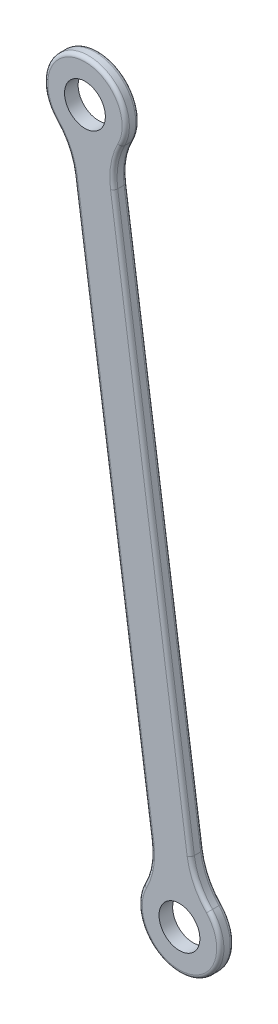
ISO-10303-21;
HEADER;
FILE_DESCRIPTION(('STEP AP214'),'2;1');
FILE_NAME('part.step','',(''),(''),'','','');
FILE_SCHEMA(('AUTOMOTIVE_DESIGN { 1 0 10303 214 1 1 1 1 }'));
ENDSEC;
DATA;
#1=APPLICATION_CONTEXT('core data for automotive mechanical design processes');
#2=APPLICATION_PROTOCOL_DEFINITION('international standard','automotive_design',2000,#1);
#3=PRODUCT_CONTEXT('',#1,'mechanical');
#4=PRODUCT('Part','Part','',(#3));
#5=PRODUCT_RELATED_PRODUCT_CATEGORY('part','',(#4));
#6=PRODUCT_DEFINITION_FORMATION('','',#4);
#7=PRODUCT_DEFINITION_CONTEXT('part definition',#1,'design');
#8=PRODUCT_DEFINITION('design','',#6,#7);
#9=PRODUCT_DEFINITION_SHAPE('','',#8);
#10=(LENGTH_UNIT() NAMED_UNIT(*) SI_UNIT(.MILLI.,.METRE.));
#11=(NAMED_UNIT(*) PLANE_ANGLE_UNIT() SI_UNIT($,.RADIAN.));
#12=(NAMED_UNIT(*) SI_UNIT($,.STERADIAN.) SOLID_ANGLE_UNIT());
#13=UNCERTAINTY_MEASURE_WITH_UNIT(LENGTH_MEASURE(1.E-05),#10,'distance_accuracy_value','');
#14=(GEOMETRIC_REPRESENTATION_CONTEXT(3) GLOBAL_UNCERTAINTY_ASSIGNED_CONTEXT((#13)) GLOBAL_UNIT_ASSIGNED_CONTEXT((#10,
#11,#12)) REPRESENTATION_CONTEXT('',''));
#15=CARTESIAN_POINT('',(0.,0.,0.));
#16=DIRECTION('',(0.,0.,1.));
#17=DIRECTION('',(1.,0.,0.));
#18=AXIS2_PLACEMENT_3D('',#15,#16,#17);
#19=CARTESIAN_POINT('',(23.1281496655135,3.28811705612887,1.5));
#20=DIRECTION('',(0.9900445829199,0.140754125449172,0.));
#21=DIRECTION('',(-0.140754125449172,0.9900445829199,0.));
#22=AXIS2_PLACEMENT_3D('',#19,#20,#21);
#23=PLANE('',#22);
#24=DIRECTION('',(0.,0.,1.));
#25=VECTOR('',#24,1.);
#26=CARTESIAN_POINT('',(10.1295553988988,94.7183880920054,1.5));
#27=LINE('',#26,#25);
#28=CARTESIAN_POINT('',(10.1295553988988,94.7183880920054,-0.7));
#29=VERTEX_POINT('',#28);
#30=CARTESIAN_POINT('',(10.1295553988988,94.7183880920054,0.7));
#31=VERTEX_POINT('',#30);
#32=EDGE_CURVE('E170',#29,#31,#27,.T.);
#33=ORIENTED_EDGE('',*,*,#32,.T.);
#34=DIRECTION('',(0.140754125449172,-0.9900445829199,0.));
#35=VECTOR('',#34,1.);
#36=CARTESIAN_POINT('',(-6.76345392352741,213.541423051097,0.7));
#37=LINE('',#36,#35);
#38=CARTESIAN_POINT('',(-6.7634539235274,213.541423051097,0.7));
#39=VERTEX_POINT('',#38);
#40=EDGE_CURVE('E229',#31,#39,#37,.F.);
#41=ORIENTED_EDGE('',*,*,#40,.T.);
#42=DIRECTION('',(0.,0.,1.));
#43=VECTOR('',#42,1.);
#44=CARTESIAN_POINT('',(-6.7634539235274,213.541423051097,-1.5));
#45=LINE('',#44,#43);
#46=CARTESIAN_POINT('',(-6.7634539235274,213.541423051097,-0.7));
#47=VERTEX_POINT('',#46);
#48=EDGE_CURVE('E293',#39,#47,#45,.F.);
#49=ORIENTED_EDGE('',*,*,#48,.T.);
#50=DIRECTION('',(0.140754125449172,-0.9900445829199,0.));
#51=VECTOR('',#50,1.);
#52=CARTESIAN_POINT('',(23.1281496655135,3.28811705612887,-0.7));
#53=LINE('',#52,#51);
#54=EDGE_CURVE('E227',#47,#29,#53,.T.);
#55=ORIENTED_EDGE('',*,*,#54,.T.);
#56=EDGE_LOOP('',(#33,#41,#49,#55));
#57=FACE_BOUND('',#56,.T.);
#58=ADVANCED_FACE('F36',(#57),#23,.F.);
#59=CARTESIAN_POINT('',(16.554056644064,81.4999999999999,1.5));
#60=DIRECTION('',(0.,0.,-1.));
#61=DIRECTION('',(-1.,0.,0.));
#62=AXIS2_PLACEMENT_3D('',#59,#60,#61);
#63=CYLINDRICAL_SURFACE('',#62,9.00000000000001);
#64=DIRECTION('',(0.,0.,-1.));
#65=VECTOR('',#64,1.);
#66=CARTESIAN_POINT('',(23.0552699234061,87.7236826635445,1.5));
#67=LINE('',#66,#65);
#68=CARTESIAN_POINT('',(23.0552699234061,87.7236826635445,-0.7));
#69=VERTEX_POINT('',#68);
#70=CARTESIAN_POINT('',(23.0552699234061,87.7236826635445,0.7));
#71=VERTEX_POINT('',#70);
#72=EDGE_CURVE('E295',#69,#71,#67,.F.);
#73=ORIENTED_EDGE('',*,*,#72,.T.);
#74=CARTESIAN_POINT('',(16.554056644064,81.4999999999999,0.7));
#75=DIRECTION('',(0.,0.,1.));
#76=DIRECTION('',(1.,0.,0.));
#77=AXIS2_PLACEMENT_3D('',#74,#75,#76);
#78=CIRCLE('',#77,9.00000000000001);
#79=CARTESIAN_POINT('',(8.57586789820257,85.6651535788504,0.7));
#80=VERTEX_POINT('',#79);
#81=EDGE_CURVE('E225',#71,#80,#78,.F.);
#82=ORIENTED_EDGE('',*,*,#81,.T.);
#83=DIRECTION('',(0.,0.,-1.));
#84=VECTOR('',#83,1.);
#85=CARTESIAN_POINT('',(8.57586789820257,85.6651535788504,1.5));
#86=LINE('',#85,#84);
#87=CARTESIAN_POINT('',(8.57586789820257,85.6651535788504,-0.7));
#88=VERTEX_POINT('',#87);
#89=EDGE_CURVE('E288',#80,#88,#86,.T.);
#90=ORIENTED_EDGE('',*,*,#89,.T.);
#91=CARTESIAN_POINT('',(16.554056644064,81.4999999999999,-0.7));
#92=DIRECTION('',(0.,0.,1.));
#93=DIRECTION('',(1.,0.,0.));
#94=AXIS2_PLACEMENT_3D('',#91,#92,#93);
#95=CIRCLE('',#94,9.00000000000001);
#96=EDGE_CURVE('E223',#88,#69,#95,.T.);
#97=ORIENTED_EDGE('',*,*,#96,.T.);
#98=EDGE_LOOP('',(#73,#82,#90,#97));
#99=FACE_BOUND('',#98,.T.);
#100=ADVANCED_FACE('F353',(#99),#63,.T.);
#101=CARTESIAN_POINT('',(32.0385509117926,4.55490418517143,1.5));
#102=DIRECTION('',(0.9900445829199,0.140754125449172,0.));
#103=DIRECTION('',(-0.140754125449172,0.9900445829199,0.));
#104=AXIS2_PLACEMENT_3D('',#101,#102,#103);
#105=PLANE('',#104);
#106=DIRECTION('',(0.,0.,-1.));
#107=VECTOR('',#106,1.);
#108=CARTESIAN_POINT('',(2.1469473227517,214.80821018014,1.5));
#109=LINE('',#108,#107);
#110=CARTESIAN_POINT('',(2.1469473227517,214.80821018014,-0.7));
#111=VERTEX_POINT('',#110);
#112=CARTESIAN_POINT('',(2.1469473227517,214.80821018014,0.7));
#113=VERTEX_POINT('',#112);
#114=EDGE_CURVE('E301',#111,#113,#109,.F.);
#115=ORIENTED_EDGE('',*,*,#114,.T.);
#116=DIRECTION('',(0.140754125449172,-0.9900445829199,0.));
#117=VECTOR('',#116,1.);
#118=CARTESIAN_POINT('',(32.0385509117926,4.55490418517143,0.7));
#119=LINE('',#118,#117);
#120=CARTESIAN_POINT('',(19.0399566451779,95.9851752210479,0.7));
#121=VERTEX_POINT('',#120);
#122=EDGE_CURVE('E221',#113,#121,#119,.T.);
#123=ORIENTED_EDGE('',*,*,#122,.T.);
#124=DIRECTION('',(0.,0.,-1.));
#125=VECTOR('',#124,1.);
#126=CARTESIAN_POINT('',(19.0399566451779,95.9851752210479,1.5));
#127=LINE('',#126,#125);
#128=CARTESIAN_POINT('',(19.0399566451779,95.9851752210479,-0.7));
#129=VERTEX_POINT('',#128);
#130=EDGE_CURVE('E304',#121,#129,#127,.T.);
#131=ORIENTED_EDGE('',*,*,#130,.T.);
#132=DIRECTION('',(0.140754125449172,-0.9900445829199,0.));
#133=VECTOR('',#132,1.);
#134=CARTESIAN_POINT('',(2.14694732275168,214.80821018014,-0.7));
#135=LINE('',#134,#133);
#136=EDGE_CURVE('E219',#129,#111,#135,.F.);
#137=ORIENTED_EDGE('',*,*,#136,.T.);
#138=EDGE_LOOP('',(#115,#123,#131,#137));
#139=FACE_BOUND('',#138,.T.);
#140=ADVANCED_FACE('F338',(#139),#105,.T.);
#141=CARTESIAN_POINT('',(16.554056644064,81.4999999999999,1.5));
#142=DIRECTION('',(0.,0.,-1.));
#143=DIRECTION('',(-1.,0.,0.));
#144=AXIS2_PLACEMENT_3D('',#141,#142,#143);
#145=CYLINDRICAL_SURFACE('',#144,4.49999999999999);
#146=CARTESIAN_POINT('',(16.554056644064,81.4999999999999,1.5));
#147=DIRECTION('',(0.,0.,1.));
#148=DIRECTION('',(1.,0.,0.));
#149=AXIS2_PLACEMENT_3D('',#146,#147,#148);
#150=CIRCLE('',#149,4.49999999999999);
#151=CARTESIAN_POINT('',(21.054056644064,81.4999999999999,1.5));
#152=VERTEX_POINT('',#151);
#153=EDGE_CURVE('E313',#152,#152,#150,.T.);
#154=ORIENTED_EDGE('',*,*,#153,.T.);
#155=EDGE_LOOP('',(#154));
#156=FACE_BOUND('',#155,.T.);
#157=CARTESIAN_POINT('',(16.554056644064,81.4999999999999,-1.5));
#158=DIRECTION('',(0.,0.,1.));
#159=DIRECTION('',(1.,0.,0.));
#160=AXIS2_PLACEMENT_3D('',#157,#158,#159);
#161=CIRCLE('',#160,4.49999999999999);
#162=CARTESIAN_POINT('',(21.054056644064,81.4999999999999,-1.5));
#163=VERTEX_POINT('',#162);
#164=EDGE_CURVE('E314',#163,#163,#161,.T.);
#165=ORIENTED_EDGE('',*,*,#164,.F.);
#166=EDGE_LOOP('',(#165));
#167=FACE_BOUND('',#166,.T.);
#168=ADVANCED_FACE('F335',(#156,#167),#145,.F.);
#169=CARTESIAN_POINT('',(-4.27755392241352,228.026598272145,1.5));
#170=DIRECTION('',(0.,0.,-1.));
#171=DIRECTION('',(-1.,0.,0.));
#172=AXIS2_PLACEMENT_3D('',#169,#170,#171);
#173=CYLINDRICAL_SURFACE('',#172,4.49999999999999);
#174=CARTESIAN_POINT('',(-4.27755392241352,228.026598272145,1.5));
#175=DIRECTION('',(0.,0.,1.));
#176=DIRECTION('',(1.,0.,0.));
#177=AXIS2_PLACEMENT_3D('',#174,#175,#176);
#178=CIRCLE('',#177,4.49999999999999);
#179=CARTESIAN_POINT('',(0.222446077586469,228.026598272145,1.5));
#180=VERTEX_POINT('',#179);
#181=EDGE_CURVE('E317',#180,#180,#178,.T.);
#182=ORIENTED_EDGE('',*,*,#181,.T.);
#183=EDGE_LOOP('',(#182));
#184=FACE_BOUND('',#183,.T.);
#185=CARTESIAN_POINT('',(-4.27755392241352,228.026598272145,-1.5));
#186=DIRECTION('',(0.,0.,1.));
#187=DIRECTION('',(1.,0.,0.));
#188=AXIS2_PLACEMENT_3D('',#185,#186,#187);
#189=CIRCLE('',#188,4.49999999999999);
#190=CARTESIAN_POINT('',(0.222446077586469,228.026598272145,-1.5));
#191=VERTEX_POINT('',#190);
#192=EDGE_CURVE('E249',#191,#191,#189,.T.);
#193=ORIENTED_EDGE('',*,*,#192,.F.);
#194=EDGE_LOOP('',(#193));
#195=FACE_BOUND('',#194,.T.);
#196=ADVANCED_FACE('F325',(#184,#195),#173,.F.);
#197=CARTESIAN_POINT('',(-4.27755392241352,228.026598272145,1.5));
#198=DIRECTION('',(0.,0.,-1.));
#199=DIRECTION('',(-1.,0.,0.));
#200=AXIS2_PLACEMENT_3D('',#197,#198,#199);
#201=CYLINDRICAL_SURFACE('',#200,9.00000000000001);
#202=DIRECTION('',(0.,0.,-1.));
#203=VECTOR('',#202,1.);
#204=CARTESIAN_POINT('',(-10.7787672017557,221.802915608601,1.5));
#205=LINE('',#204,#203);
#206=CARTESIAN_POINT('',(-10.7787672017557,221.802915608601,-0.7));
#207=VERTEX_POINT('',#206);
#208=CARTESIAN_POINT('',(-10.7787672017557,221.802915608601,0.7));
#209=VERTEX_POINT('',#208);
#210=EDGE_CURVE('E310',#207,#209,#205,.F.);
#211=ORIENTED_EDGE('',*,*,#210,.T.);
#212=CARTESIAN_POINT('',(-4.27755392241352,228.026598272145,0.7));
#213=DIRECTION('',(0.,0.,1.));
#214=DIRECTION('',(1.,0.,0.));
#215=AXIS2_PLACEMENT_3D('',#212,#213,#214);
#216=CIRCLE('',#215,9.00000000000001);
#217=CARTESIAN_POINT('',(3.70063482344788,223.861444693295,0.7));
#218=VERTEX_POINT('',#217);
#219=EDGE_CURVE('E11',#209,#218,#216,.F.);
#220=ORIENTED_EDGE('',*,*,#219,.T.);
#221=DIRECTION('',(0.,0.,-1.));
#222=VECTOR('',#221,1.);
#223=CARTESIAN_POINT('',(3.70063482344788,223.861444693295,1.5));
#224=LINE('',#223,#222);
#225=CARTESIAN_POINT('',(3.70063482344788,223.861444693295,-0.7));
#226=VERTEX_POINT('',#225);
#227=EDGE_CURVE('E307',#218,#226,#224,.T.);
#228=ORIENTED_EDGE('',*,*,#227,.T.);
#229=CARTESIAN_POINT('',(-4.27755392241352,228.026598272145,-0.7));
#230=DIRECTION('',(0.,0.,1.));
#231=DIRECTION('',(1.,0.,0.));
#232=AXIS2_PLACEMENT_3D('',#229,#230,#231);
#233=CIRCLE('',#232,9.00000000000001);
#234=EDGE_CURVE('E45',#226,#207,#233,.T.);
#235=ORIENTED_EDGE('',*,*,#234,.T.);
#236=EDGE_LOOP('',(#211,#220,#228,#235));
#237=FACE_BOUND('',#236,.T.);
#238=ADVANCED_FACE('F331',(#237),#201,.T.);
#239=CARTESIAN_POINT('',(0.,0.,1.5));
#240=DIRECTION('',(0.,0.,1.));
#241=DIRECTION('',(1.,0.,0.));
#242=AXIS2_PLACEMENT_3D('',#239,#240,#241);
#243=PLANE('',#242);
#244=DIRECTION('',(0.140754125449172,-0.9900445829199,0.));
#245=VECTOR('',#244,1.);
#246=CARTESIAN_POINT('',(31.2465152454567,4.44230088481209,1.5));
#247=LINE('',#246,#245);
#248=CARTESIAN_POINT('',(18.247920978842,95.8725719206885,1.5));
#249=VERTEX_POINT('',#248);
#250=CARTESIAN_POINT('',(1.35491165641578,214.69560687978,1.5));
#251=VERTEX_POINT('',#250);
#252=EDGE_CURVE('E53',#249,#251,#247,.F.);
#253=ORIENTED_EDGE('',*,*,#252,.T.);
#254=CARTESIAN_POINT('',(16.9976160665502,216.919522061877,1.5));
#255=DIRECTION('',(0.,0.,1.));
#256=DIRECTION('',(1.,0.,0.));
#257=AXIS2_PLACEMENT_3D('',#254,#255,#256);
#258=CIRCLE('',#257,15.8);
#259=CARTESIAN_POINT('',(2.99146249048242,224.23168056697,1.5));
#260=VERTEX_POINT('',#259);
#261=EDGE_CURVE('E217',#251,#260,#258,.F.);
#262=ORIENTED_EDGE('',*,*,#261,.T.);
#263=CARTESIAN_POINT('',(-4.27755392241352,228.026598272145,1.5));
#264=DIRECTION('',(0.,0.,1.));
#265=DIRECTION('',(1.,0.,0.));
#266=AXIS2_PLACEMENT_3D('',#263,#264,#265);
#267=CIRCLE('',#266,8.20000000000001);
#268=CARTESIAN_POINT('',(-10.2008815769253,222.35613184536,1.5));
#269=VERTEX_POINT('',#268);
#270=EDGE_CURVE('E205',#260,#269,#267,.T.);
#271=ORIENTED_EDGE('',*,*,#270,.T.);
#272=CARTESIAN_POINT('',(-21.6141226673259,211.43011116936,1.5));
#273=DIRECTION('',(0.,0.,1.));
#274=DIRECTION('',(1.,0.,0.));
#275=AXIS2_PLACEMENT_3D('',#272,#273,#274);
#276=CIRCLE('',#275,15.8);
#277=CARTESIAN_POINT('',(-5.97141825719148,213.654026351457,1.5));
#278=VERTEX_POINT('',#277);
#279=EDGE_CURVE('E207',#269,#278,#276,.F.);
#280=ORIENTED_EDGE('',*,*,#279,.T.);
#281=DIRECTION('',(0.140754125449172,-0.9900445829199,0.));
#282=VECTOR('',#281,1.);
#283=CARTESIAN_POINT('',(10.9215910652347,94.8309913923647,1.5));
#284=LINE('',#283,#282);
#285=CARTESIAN_POINT('',(10.9215910652347,94.8309913923647,1.5));
#286=VERTEX_POINT('',#285);
#287=EDGE_CURVE('E209',#278,#286,#284,.T.);
#288=ORIENTED_EDGE('',*,*,#287,.T.);
#289=CARTESIAN_POINT('',(-4.72111334489974,92.6070762102678,1.5));
#290=DIRECTION('',(0.,0.,1.));
#291=DIRECTION('',(1.,0.,0.));
#292=AXIS2_PLACEMENT_3D('',#289,#290,#291);
#293=CIRCLE('',#292,15.8);
#294=CARTESIAN_POINT('',(9.28504023116803,85.2949177051748,1.5));
#295=VERTEX_POINT('',#294);
#296=EDGE_CURVE('E211',#286,#295,#293,.F.);
#297=ORIENTED_EDGE('',*,*,#296,.T.);
#298=CARTESIAN_POINT('',(16.554056644064,81.4999999999999,1.5));
#299=DIRECTION('',(0.,0.,1.));
#300=DIRECTION('',(1.,0.,0.));
#301=AXIS2_PLACEMENT_3D('',#298,#299,#300);
#302=CIRCLE('',#301,8.20000000000002);
#303=CARTESIAN_POINT('',(22.4773842985757,87.170466426785,1.5));
#304=VERTEX_POINT('',#303);
#305=EDGE_CURVE('E213',#295,#304,#302,.T.);
#306=ORIENTED_EDGE('',*,*,#305,.T.);
#307=CARTESIAN_POINT('',(33.8906253889764,98.0964871027854,1.5));
#308=DIRECTION('',(0.,0.,1.));
#309=DIRECTION('',(1.,0.,0.));
#310=AXIS2_PLACEMENT_3D('',#307,#308,#309);
#311=CIRCLE('',#310,15.8);
#312=EDGE_CURVE('E58',#304,#249,#311,.F.);
#313=ORIENTED_EDGE('',*,*,#312,.T.);
#314=EDGE_LOOP('',(#253,#262,#271,#280,#288,#297,#306,#313));
#315=FACE_BOUND('',#314,.T.);
#316=ORIENTED_EDGE('',*,*,#181,.F.);
#317=EDGE_LOOP('',(#316));
#318=FACE_BOUND('',#317,.T.);
#319=ORIENTED_EDGE('',*,*,#153,.F.);
#320=EDGE_LOOP('',(#319));
#321=FACE_BOUND('',#320,.T.);
#322=ADVANCED_FACE('F328',(#315,#318,#321),#243,.T.);
#323=CARTESIAN_POINT('',(0.,0.,-1.5));
#324=DIRECTION('',(0.,0.,1.));
#325=DIRECTION('',(1.,0.,0.));
#326=AXIS2_PLACEMENT_3D('',#323,#324,#325);
#327=PLANE('',#326);
#328=CARTESIAN_POINT('',(-4.72111334489974,92.6070762102678,-1.5));
#329=DIRECTION('',(0.,0.,1.));
#330=DIRECTION('',(1.,0.,0.));
#331=AXIS2_PLACEMENT_3D('',#328,#329,#330);
#332=CIRCLE('',#331,15.8);
#333=CARTESIAN_POINT('',(9.28504023116803,85.2949177051748,-1.5));
#334=VERTEX_POINT('',#333);
#335=CARTESIAN_POINT('',(10.9215910652347,94.8309913923647,-1.5));
#336=VERTEX_POINT('',#335);
#337=EDGE_CURVE('E183',#334,#336,#332,.T.);
#338=ORIENTED_EDGE('',*,*,#337,.T.);
#339=DIRECTION('',(0.140754125449172,-0.9900445829199,0.));
#340=VECTOR('',#339,1.);
#341=CARTESIAN_POINT('',(23.9201853318494,3.40072035648821,-1.5));
#342=LINE('',#341,#340);
#343=CARTESIAN_POINT('',(-5.97141825719148,213.654026351457,-1.5));
#344=VERTEX_POINT('',#343);
#345=EDGE_CURVE('E187',#336,#344,#342,.F.);
#346=ORIENTED_EDGE('',*,*,#345,.T.);
#347=CARTESIAN_POINT('',(-21.6141226673259,211.43011116936,-1.5));
#348=DIRECTION('',(0.,0.,1.));
#349=DIRECTION('',(1.,0.,0.));
#350=AXIS2_PLACEMENT_3D('',#347,#348,#349);
#351=CIRCLE('',#350,15.8);
#352=CARTESIAN_POINT('',(-10.2008815769253,222.35613184536,-1.5));
#353=VERTEX_POINT('',#352);
#354=EDGE_CURVE('E185',#344,#353,#351,.T.);
#355=ORIENTED_EDGE('',*,*,#354,.T.);
#356=CARTESIAN_POINT('',(-4.27755392241352,228.026598272145,-1.5));
#357=DIRECTION('',(0.,0.,1.));
#358=DIRECTION('',(1.,0.,0.));
#359=AXIS2_PLACEMENT_3D('',#356,#357,#358);
#360=CIRCLE('',#359,8.20000000000001);
#361=CARTESIAN_POINT('',(2.99146249048243,224.23168056697,-1.5));
#362=VERTEX_POINT('',#361);
#363=EDGE_CURVE('E175',#353,#362,#360,.F.);
#364=ORIENTED_EDGE('',*,*,#363,.T.);
#365=CARTESIAN_POINT('',(16.9976160665502,216.919522061877,-1.5));
#366=DIRECTION('',(0.,0.,1.));
#367=DIRECTION('',(1.,0.,0.));
#368=AXIS2_PLACEMENT_3D('',#365,#366,#367);
#369=CIRCLE('',#368,15.8);
#370=CARTESIAN_POINT('',(1.35491165641578,214.69560687978,-1.5));
#371=VERTEX_POINT('',#370);
#372=EDGE_CURVE('E155',#362,#371,#369,.T.);
#373=ORIENTED_EDGE('',*,*,#372,.T.);
#374=DIRECTION('',(0.140754125449172,-0.9900445829199,0.));
#375=VECTOR('',#374,1.);
#376=CARTESIAN_POINT('',(18.2479209788419,95.8725719206886,-1.5));
#377=LINE('',#376,#375);
#378=CARTESIAN_POINT('',(18.247920978842,95.8725719206885,-1.5));
#379=VERTEX_POINT('',#378);
#380=EDGE_CURVE('E163',#371,#379,#377,.T.);
#381=ORIENTED_EDGE('',*,*,#380,.T.);
#382=CARTESIAN_POINT('',(33.8906253889764,98.0964871027854,-1.5));
#383=DIRECTION('',(0.,0.,1.));
#384=DIRECTION('',(1.,0.,0.));
#385=AXIS2_PLACEMENT_3D('',#382,#383,#384);
#386=CIRCLE('',#385,15.8);
#387=CARTESIAN_POINT('',(22.4773842985757,87.170466426785,-1.5));
#388=VERTEX_POINT('',#387);
#389=EDGE_CURVE('E169',#379,#388,#386,.T.);
#390=ORIENTED_EDGE('',*,*,#389,.T.);
#391=CARTESIAN_POINT('',(16.554056644064,81.4999999999999,-1.5));
#392=DIRECTION('',(0.,0.,1.));
#393=DIRECTION('',(1.,0.,0.));
#394=AXIS2_PLACEMENT_3D('',#391,#392,#393);
#395=CIRCLE('',#394,8.20000000000002);
#396=EDGE_CURVE('E177',#388,#334,#395,.F.);
#397=ORIENTED_EDGE('',*,*,#396,.T.);
#398=EDGE_LOOP('',(#338,#346,#355,#364,#373,#381,#390,#397));
#399=FACE_BOUND('',#398,.T.);
#400=ORIENTED_EDGE('',*,*,#192,.T.);
#401=EDGE_LOOP('',(#400));
#402=FACE_BOUND('',#401,.T.);
#403=ORIENTED_EDGE('',*,*,#164,.T.);
#404=EDGE_LOOP('',(#403));
#405=FACE_BOUND('',#404,.T.);
#406=ADVANCED_FACE('F172',(#399,#402,#405),#327,.F.);
#407=CARTESIAN_POINT('',(16.9976160665502,216.919522061877,1.5));
#408=DIRECTION('',(0.,0.,-1.));
#409=DIRECTION('',(-1.,0.,0.));
#410=AXIS2_PLACEMENT_3D('',#407,#408,#409);
#411=CYLINDRICAL_SURFACE('',#410,15.);
#412=ORIENTED_EDGE('',*,*,#114,.F.);
#413=CARTESIAN_POINT('',(16.9976160665502,216.919522061877,-0.7));
#414=DIRECTION('',(0.,0.,1.));
#415=DIRECTION('',(1.,0.,0.));
#416=AXIS2_PLACEMENT_3D('',#413,#414,#415);
#417=CIRCLE('',#416,15.);
#418=EDGE_CURVE('E157',#111,#226,#417,.F.);
#419=ORIENTED_EDGE('',*,*,#418,.T.);
#420=ORIENTED_EDGE('',*,*,#227,.F.);
#421=CARTESIAN_POINT('',(16.9976160665502,216.919522061877,0.7));
#422=DIRECTION('',(0.,0.,1.));
#423=DIRECTION('',(1.,0.,0.));
#424=AXIS2_PLACEMENT_3D('',#421,#422,#423);
#425=CIRCLE('',#424,15.);
#426=EDGE_CURVE('E189',#218,#113,#425,.T.);
#427=ORIENTED_EDGE('',*,*,#426,.T.);
#428=EDGE_LOOP('',(#412,#419,#420,#427));
#429=FACE_BOUND('',#428,.T.);
#430=ADVANCED_FACE('F343',(#429),#411,.F.);
#431=CARTESIAN_POINT('',(33.8906253889764,98.0964871027854,1.5));
#432=DIRECTION('',(0.,0.,-1.));
#433=DIRECTION('',(-1.,0.,0.));
#434=AXIS2_PLACEMENT_3D('',#431,#432,#433);
#435=CYLINDRICAL_SURFACE('',#434,15.);
#436=ORIENTED_EDGE('',*,*,#72,.F.);
#437=CARTESIAN_POINT('',(33.8906253889764,98.0964871027854,-0.7));
#438=DIRECTION('',(0.,0.,1.));
#439=DIRECTION('',(1.,0.,0.));
#440=AXIS2_PLACEMENT_3D('',#437,#438,#439);
#441=CIRCLE('',#440,15.);
#442=EDGE_CURVE('E203',#69,#129,#441,.F.);
#443=ORIENTED_EDGE('',*,*,#442,.T.);
#444=ORIENTED_EDGE('',*,*,#130,.F.);
#445=CARTESIAN_POINT('',(33.8906253889764,98.0964871027854,0.7));
#446=DIRECTION('',(0.,0.,1.));
#447=DIRECTION('',(1.,0.,0.));
#448=AXIS2_PLACEMENT_3D('',#445,#446,#447);
#449=CIRCLE('',#448,15.);
#450=EDGE_CURVE('E201',#121,#71,#449,.T.);
#451=ORIENTED_EDGE('',*,*,#450,.T.);
#452=EDGE_LOOP('',(#436,#443,#444,#451));
#453=FACE_BOUND('',#452,.T.);
#454=ADVANCED_FACE('F348',(#453),#435,.F.);
#455=CARTESIAN_POINT('',(-4.72111334489974,92.6070762102678,1.5));
#456=DIRECTION('',(0.,0.,-1.));
#457=DIRECTION('',(-1.,0.,0.));
#458=AXIS2_PLACEMENT_3D('',#455,#456,#457);
#459=CYLINDRICAL_SURFACE('',#458,15.);
#460=ORIENTED_EDGE('',*,*,#32,.F.);
#461=CARTESIAN_POINT('',(-4.72111334489974,92.6070762102678,-0.7));
#462=DIRECTION('',(0.,0.,1.));
#463=DIRECTION('',(1.,0.,0.));
#464=AXIS2_PLACEMENT_3D('',#461,#462,#463);
#465=CIRCLE('',#464,15.);
#466=EDGE_CURVE('E199',#29,#88,#465,.F.);
#467=ORIENTED_EDGE('',*,*,#466,.T.);
#468=ORIENTED_EDGE('',*,*,#89,.F.);
#469=CARTESIAN_POINT('',(-4.72111334489974,92.6070762102678,0.7));
#470=DIRECTION('',(0.,0.,1.));
#471=DIRECTION('',(1.,0.,0.));
#472=AXIS2_PLACEMENT_3D('',#469,#470,#471);
#473=CIRCLE('',#472,15.);
#474=EDGE_CURVE('E197',#80,#31,#473,.T.);
#475=ORIENTED_EDGE('',*,*,#474,.T.);
#476=EDGE_LOOP('',(#460,#467,#468,#475));
#477=FACE_BOUND('',#476,.T.);
#478=ADVANCED_FACE('F285',(#477),#459,.F.);
#479=CARTESIAN_POINT('',(-21.6141226673259,211.43011116936,1.5));
#480=DIRECTION('',(0.,0.,-1.));
#481=DIRECTION('',(-1.,0.,0.));
#482=AXIS2_PLACEMENT_3D('',#479,#480,#481);
#483=CYLINDRICAL_SURFACE('',#482,15.);
#484=ORIENTED_EDGE('',*,*,#210,.F.);
#485=CARTESIAN_POINT('',(-21.6141226673259,211.43011116936,-0.7));
#486=DIRECTION('',(0.,0.,1.));
#487=DIRECTION('',(1.,0.,0.));
#488=AXIS2_PLACEMENT_3D('',#485,#486,#487);
#489=CIRCLE('',#488,15.);
#490=EDGE_CURVE('E195',#207,#47,#489,.F.);
#491=ORIENTED_EDGE('',*,*,#490,.T.);
#492=ORIENTED_EDGE('',*,*,#48,.F.);
#493=CARTESIAN_POINT('',(-21.6141226673259,211.43011116936,0.7));
#494=DIRECTION('',(0.,0.,1.));
#495=DIRECTION('',(1.,0.,0.));
#496=AXIS2_PLACEMENT_3D('',#493,#494,#495);
#497=CIRCLE('',#496,15.);
#498=EDGE_CURVE('E193',#39,#209,#497,.T.);
#499=ORIENTED_EDGE('',*,*,#498,.T.);
#500=EDGE_LOOP('',(#484,#491,#492,#499));
#501=FACE_BOUND('',#500,.T.);
#502=ADVANCED_FACE('F369',(#501),#483,.F.);
#503=CARTESIAN_POINT('',(-4.72111334489974,92.6070762102678,-0.7));
#504=DIRECTION('',(0.,0.,1.));
#505=DIRECTION('',(1.,0.,0.));
#506=AXIS2_PLACEMENT_3D('',#503,#504,#505);
#507=TOROIDAL_SURFACE('',#506,15.8,0.8);
#508=CARTESIAN_POINT('',(9.28504023116803,85.2949177051748,-0.7));
#509=DIRECTION('',(-0.462794842094499,-0.886465416206818,0.));
#510=DIRECTION('',(0.886465416206818,-0.4627948420945,0.));
#511=AXIS2_PLACEMENT_3D('',#508,#509,#510);
#512=CIRCLE('',#511,0.8);
#513=EDGE_CURVE('E243',#88,#334,#512,.T.);
#514=ORIENTED_EDGE('',*,*,#513,.F.);
#515=ORIENTED_EDGE('',*,*,#466,.F.);
#516=CARTESIAN_POINT('',(10.9215910652347,94.8309913923647,-0.7));
#517=DIRECTION('',(-0.140754125449172,0.9900445829199,0.));
#518=DIRECTION('',(-0.9900445829199,-0.140754125449172,0.));
#519=AXIS2_PLACEMENT_3D('',#516,#517,#518);
#520=CIRCLE('',#519,0.8);
#521=EDGE_CURVE('E246',#336,#29,#520,.T.);
#522=ORIENTED_EDGE('',*,*,#521,.F.);
#523=ORIENTED_EDGE('',*,*,#337,.F.);
#524=EDGE_LOOP('',(#514,#515,#522,#523));
#525=FACE_BOUND('',#524,.T.);
#526=ADVANCED_FACE('F372',(#525),#507,.T.);
#527=CARTESIAN_POINT('',(23.9201853318494,3.40072035648821,-0.7));
#528=DIRECTION('',(0.140754125449172,-0.9900445829199,0.));
#529=DIRECTION('',(0.9900445829199,0.140754125449172,0.));
#530=AXIS2_PLACEMENT_3D('',#527,#528,#529);
#531=CYLINDRICAL_SURFACE('',#530,0.8);
#532=ORIENTED_EDGE('',*,*,#521,.T.);
#533=ORIENTED_EDGE('',*,*,#54,.F.);
#534=CARTESIAN_POINT('',(-5.97141825719148,213.654026351457,-0.7));
#535=DIRECTION('',(-0.140754125449171,0.9900445829199,0.));
#536=DIRECTION('',(-0.9900445829199,-0.140754125449171,0.));
#537=AXIS2_PLACEMENT_3D('',#534,#535,#536);
#538=CIRCLE('',#537,0.8);
#539=EDGE_CURVE('E240',#344,#47,#538,.T.);
#540=ORIENTED_EDGE('',*,*,#539,.F.);
#541=ORIENTED_EDGE('',*,*,#345,.F.);
#542=EDGE_LOOP('',(#532,#533,#540,#541));
#543=FACE_BOUND('',#542,.T.);
#544=ADVANCED_FACE('F393',(#543),#531,.T.);
#545=CARTESIAN_POINT('',(16.554056644064,81.4999999999999,-0.7));
#546=DIRECTION('',(0.,0.,1.));
#547=DIRECTION('',(1.,0.,0.));
#548=AXIS2_PLACEMENT_3D('',#545,#546,#547);
#549=TOROIDAL_SURFACE('',#548,8.20000000000002,0.8);
#550=ORIENTED_EDGE('',*,*,#513,.T.);
#551=ORIENTED_EDGE('',*,*,#396,.F.);
#552=CARTESIAN_POINT('',(22.4773842985757,87.170466426785,-0.7));
#553=DIRECTION('',(-0.691520295949401,0.722357031038013,0.));
#554=DIRECTION('',(-0.722357031038013,-0.691520295949401,0.));
#555=AXIS2_PLACEMENT_3D('',#552,#553,#554);
#556=CIRCLE('',#555,0.8);
#557=EDGE_CURVE('E237',#69,#388,#556,.T.);
#558=ORIENTED_EDGE('',*,*,#557,.F.);
#559=ORIENTED_EDGE('',*,*,#96,.F.);
#560=EDGE_LOOP('',(#550,#551,#558,#559));
#561=FACE_BOUND('',#560,.T.);
#562=ADVANCED_FACE('F389',(#561),#549,.T.);
#563=CARTESIAN_POINT('',(-21.6141226673259,211.43011116936,-0.7));
#564=DIRECTION('',(0.,0.,1.));
#565=DIRECTION('',(1.,0.,0.));
#566=AXIS2_PLACEMENT_3D('',#563,#564,#565);
#567=TOROIDAL_SURFACE('',#566,15.8,0.8);
#568=ORIENTED_EDGE('',*,*,#539,.T.);
#569=ORIENTED_EDGE('',*,*,#490,.F.);
#570=CARTESIAN_POINT('',(-10.2008815769253,222.35613184536,-0.7));
#571=DIRECTION('',(-0.691520295949402,0.722357031038012,0.));
#572=DIRECTION('',(-0.722357031038012,-0.691520295949402,0.));
#573=AXIS2_PLACEMENT_3D('',#570,#571,#572);
#574=CIRCLE('',#573,0.8);
#575=EDGE_CURVE('E234',#353,#207,#574,.T.);
#576=ORIENTED_EDGE('',*,*,#575,.F.);
#577=ORIENTED_EDGE('',*,*,#354,.F.);
#578=EDGE_LOOP('',(#568,#569,#576,#577));
#579=FACE_BOUND('',#578,.T.);
#580=ADVANCED_FACE('F385',(#579),#567,.T.);
#581=CARTESIAN_POINT('',(33.8906253889764,98.0964871027854,-0.7));
#582=DIRECTION('',(0.,0.,1.));
#583=DIRECTION('',(1.,0.,0.));
#584=AXIS2_PLACEMENT_3D('',#581,#582,#583);
#585=TOROIDAL_SURFACE('',#584,15.8,0.8);
#586=ORIENTED_EDGE('',*,*,#557,.T.);
#587=ORIENTED_EDGE('',*,*,#389,.F.);
#588=CARTESIAN_POINT('',(18.247920978842,95.8725719206885,-0.7));
#589=DIRECTION('',(-0.140754125449172,0.9900445829199,0.));
#590=DIRECTION('',(-0.9900445829199,-0.140754125449172,0.));
#591=AXIS2_PLACEMENT_3D('',#588,#589,#590);
#592=CIRCLE('',#591,0.8);
#593=EDGE_CURVE('E166',#129,#379,#592,.T.);
#594=ORIENTED_EDGE('',*,*,#593,.F.);
#595=ORIENTED_EDGE('',*,*,#442,.F.);
#596=EDGE_LOOP('',(#586,#587,#594,#595));
#597=FACE_BOUND('',#596,.T.);
#598=ADVANCED_FACE('F381',(#597),#585,.T.);
#599=CARTESIAN_POINT('',(-4.27755392241352,228.026598272145,-0.7));
#600=DIRECTION('',(0.,0.,1.));
#601=DIRECTION('',(1.,0.,0.));
#602=AXIS2_PLACEMENT_3D('',#599,#600,#601);
#603=TOROIDAL_SURFACE('',#602,8.20000000000001,0.8);
#604=ORIENTED_EDGE('',*,*,#575,.T.);
#605=ORIENTED_EDGE('',*,*,#234,.F.);
#606=CARTESIAN_POINT('',(2.99146249048242,224.23168056697,-0.7));
#607=DIRECTION('',(-0.4627948420945,-0.886465416206818,0.));
#608=DIRECTION('',(0.886465416206818,-0.4627948420945,0.));
#609=AXIS2_PLACEMENT_3D('',#606,#607,#608);
#610=CIRCLE('',#609,0.8);
#611=EDGE_CURVE('E160',#362,#226,#610,.T.);
#612=ORIENTED_EDGE('',*,*,#611,.F.);
#613=ORIENTED_EDGE('',*,*,#363,.F.);
#614=EDGE_LOOP('',(#604,#605,#612,#613));
#615=FACE_BOUND('',#614,.T.);
#616=ADVANCED_FACE('F378',(#615),#603,.T.);
#617=CARTESIAN_POINT('',(31.2465152454567,4.44230088481209,-0.7));
#618=DIRECTION('',(-0.140754125449172,0.9900445829199,0.));
#619=DIRECTION('',(-0.9900445829199,-0.140754125449172,0.));
#620=AXIS2_PLACEMENT_3D('',#617,#618,#619);
#621=CYLINDRICAL_SURFACE('',#620,0.8);
#622=ORIENTED_EDGE('',*,*,#593,.T.);
#623=ORIENTED_EDGE('',*,*,#380,.F.);
#624=CARTESIAN_POINT('',(1.35491165641578,214.69560687978,-0.7));
#625=DIRECTION('',(-0.140754125449172,0.9900445829199,0.));
#626=DIRECTION('',(-0.9900445829199,-0.140754125449172,0.));
#627=AXIS2_PLACEMENT_3D('',#624,#625,#626);
#628=CIRCLE('',#627,0.8);
#629=EDGE_CURVE('E151',#111,#371,#628,.T.);
#630=ORIENTED_EDGE('',*,*,#629,.F.);
#631=ORIENTED_EDGE('',*,*,#136,.F.);
#632=EDGE_LOOP('',(#622,#623,#630,#631));
#633=FACE_BOUND('',#632,.T.);
#634=ADVANCED_FACE('F164',(#633),#621,.T.);
#635=CARTESIAN_POINT('',(16.9976160665502,216.919522061877,-0.7));
#636=DIRECTION('',(0.,0.,1.));
#637=DIRECTION('',(1.,0.,0.));
#638=AXIS2_PLACEMENT_3D('',#635,#636,#637);
#639=TOROIDAL_SURFACE('',#638,15.8,0.8);
#640=ORIENTED_EDGE('',*,*,#611,.T.);
#641=ORIENTED_EDGE('',*,*,#418,.F.);
#642=ORIENTED_EDGE('',*,*,#629,.T.);
#643=ORIENTED_EDGE('',*,*,#372,.F.);
#644=EDGE_LOOP('',(#640,#641,#642,#643));
#645=FACE_BOUND('',#644,.T.);
#646=ADVANCED_FACE('F153',(#645),#639,.T.);
#647=CARTESIAN_POINT('',(-4.72111334489974,92.6070762102678,0.7));
#648=DIRECTION('',(0.,0.,1.));
#649=DIRECTION('',(1.,0.,0.));
#650=AXIS2_PLACEMENT_3D('',#647,#648,#649);
#651=TOROIDAL_SURFACE('',#650,15.8,0.8);
#652=CARTESIAN_POINT('',(10.9215910652347,94.8309913923647,0.7));
#653=DIRECTION('',(-0.140754125449172,0.9900445829199,0.));
#654=DIRECTION('',(-0.9900445829199,-0.140754125449172,0.));
#655=AXIS2_PLACEMENT_3D('',#652,#653,#654);
#656=CIRCLE('',#655,0.8);
#657=EDGE_CURVE('E265',#31,#286,#656,.T.);
#658=ORIENTED_EDGE('',*,*,#657,.F.);
#659=ORIENTED_EDGE('',*,*,#474,.F.);
#660=CARTESIAN_POINT('',(9.28504023116803,85.2949177051748,0.7));
#661=DIRECTION('',(-0.462794842094501,-0.886465416206817,0.));
#662=DIRECTION('',(0.886465416206817,-0.462794842094501,0.));
#663=AXIS2_PLACEMENT_3D('',#660,#661,#662);
#664=CIRCLE('',#663,0.8);
#665=EDGE_CURVE('E40',#295,#80,#664,.T.);
#666=ORIENTED_EDGE('',*,*,#665,.F.);
#667=ORIENTED_EDGE('',*,*,#296,.F.);
#668=EDGE_LOOP('',(#658,#659,#666,#667));
#669=FACE_BOUND('',#668,.T.);
#670=ADVANCED_FACE('F38',(#669),#651,.T.);
#671=CARTESIAN_POINT('',(16.554056644064,81.4999999999999,0.7));
#672=DIRECTION('',(0.,0.,1.));
#673=DIRECTION('',(1.,0.,0.));
#674=AXIS2_PLACEMENT_3D('',#671,#672,#673);
#675=TOROIDAL_SURFACE('',#674,8.20000000000002,0.8);
#676=ORIENTED_EDGE('',*,*,#665,.T.);
#677=ORIENTED_EDGE('',*,*,#81,.F.);
#678=CARTESIAN_POINT('',(22.4773842985757,87.170466426785,0.7));
#679=DIRECTION('',(-0.691520295949405,0.722357031038009,0.));
#680=DIRECTION('',(-0.722357031038009,-0.691520295949406,0.));
#681=AXIS2_PLACEMENT_3D('',#678,#679,#680);
#682=CIRCLE('',#681,0.8);
#683=EDGE_CURVE('E263',#304,#71,#682,.T.);
#684=ORIENTED_EDGE('',*,*,#683,.F.);
#685=ORIENTED_EDGE('',*,*,#305,.F.);
#686=EDGE_LOOP('',(#676,#677,#684,#685));
#687=FACE_BOUND('',#686,.T.);
#688=ADVANCED_FACE('F276',(#687),#675,.T.);
#689=CARTESIAN_POINT('',(23.9201853318494,3.40072035648821,0.7));
#690=DIRECTION('',(-0.140754125449172,0.9900445829199,0.));
#691=DIRECTION('',(-0.9900445829199,-0.140754125449172,0.));
#692=AXIS2_PLACEMENT_3D('',#689,#690,#691);
#693=CYLINDRICAL_SURFACE('',#692,0.8);
#694=ORIENTED_EDGE('',*,*,#657,.T.);
#695=ORIENTED_EDGE('',*,*,#287,.F.);
#696=CARTESIAN_POINT('',(-5.97141825719148,213.654026351457,0.7));
#697=DIRECTION('',(-0.140754125449172,0.9900445829199,0.));
#698=DIRECTION('',(-0.9900445829199,-0.140754125449172,0.));
#699=AXIS2_PLACEMENT_3D('',#696,#697,#698);
#700=CIRCLE('',#699,0.8);
#701=EDGE_CURVE('E260',#39,#278,#700,.T.);
#702=ORIENTED_EDGE('',*,*,#701,.F.);
#703=ORIENTED_EDGE('',*,*,#40,.F.);
#704=EDGE_LOOP('',(#694,#695,#702,#703));
#705=FACE_BOUND('',#704,.T.);
#706=ADVANCED_FACE('F420',(#705),#693,.T.);
#707=CARTESIAN_POINT('',(33.8906253889764,98.0964871027854,0.7));
#708=DIRECTION('',(0.,0.,1.));
#709=DIRECTION('',(1.,0.,0.));
#710=AXIS2_PLACEMENT_3D('',#707,#708,#709);
#711=TOROIDAL_SURFACE('',#710,15.8,0.8);
#712=ORIENTED_EDGE('',*,*,#683,.T.);
#713=ORIENTED_EDGE('',*,*,#450,.F.);
#714=CARTESIAN_POINT('',(18.247920978842,95.8725719206885,0.7));
#715=DIRECTION('',(-0.140754125449172,0.9900445829199,0.));
#716=DIRECTION('',(-0.9900445829199,-0.140754125449172,0.));
#717=AXIS2_PLACEMENT_3D('',#714,#715,#716);
#718=CIRCLE('',#717,0.8);
#719=EDGE_CURVE('E257',#249,#121,#718,.T.);
#720=ORIENTED_EDGE('',*,*,#719,.F.);
#721=ORIENTED_EDGE('',*,*,#312,.F.);
#722=EDGE_LOOP('',(#712,#713,#720,#721));
#723=FACE_BOUND('',#722,.T.);
#724=ADVANCED_FACE('F416',(#723),#711,.T.);
#725=CARTESIAN_POINT('',(-21.6141226673259,211.43011116936,0.7));
#726=DIRECTION('',(0.,0.,1.));
#727=DIRECTION('',(1.,0.,0.));
#728=AXIS2_PLACEMENT_3D('',#725,#726,#727);
#729=TOROIDAL_SURFACE('',#728,15.8,0.8);
#730=ORIENTED_EDGE('',*,*,#701,.T.);
#731=ORIENTED_EDGE('',*,*,#279,.F.);
#732=CARTESIAN_POINT('',(-10.2008815769253,222.35613184536,0.7));
#733=DIRECTION('',(-0.691520295949401,0.722357031038013,0.));
#734=DIRECTION('',(-0.722357031038013,-0.691520295949401,0.));
#735=AXIS2_PLACEMENT_3D('',#732,#733,#734);
#736=CIRCLE('',#735,0.8);
#737=EDGE_CURVE('E254',#209,#269,#736,.T.);
#738=ORIENTED_EDGE('',*,*,#737,.F.);
#739=ORIENTED_EDGE('',*,*,#498,.F.);
#740=EDGE_LOOP('',(#730,#731,#738,#739));
#741=FACE_BOUND('',#740,.T.);
#742=ADVANCED_FACE('F412',(#741),#729,.T.);
#743=CARTESIAN_POINT('',(31.2465152454567,4.44230088481209,0.7));
#744=DIRECTION('',(0.140754125449172,-0.9900445829199,0.));
#745=DIRECTION('',(0.9900445829199,0.140754125449172,0.));
#746=AXIS2_PLACEMENT_3D('',#743,#744,#745);
#747=CYLINDRICAL_SURFACE('',#746,0.8);
#748=ORIENTED_EDGE('',*,*,#719,.T.);
#749=ORIENTED_EDGE('',*,*,#122,.F.);
#750=CARTESIAN_POINT('',(1.35491165641578,214.69560687978,0.7));
#751=DIRECTION('',(-0.140754125449172,0.9900445829199,0.));
#752=DIRECTION('',(-0.9900445829199,-0.140754125449172,0.));
#753=AXIS2_PLACEMENT_3D('',#750,#751,#752);
#754=CIRCLE('',#753,0.8);
#755=EDGE_CURVE('E252',#251,#113,#754,.T.);
#756=ORIENTED_EDGE('',*,*,#755,.F.);
#757=ORIENTED_EDGE('',*,*,#252,.F.);
#758=EDGE_LOOP('',(#748,#749,#756,#757));
#759=FACE_BOUND('',#758,.T.);
#760=ADVANCED_FACE('F408',(#759),#747,.T.);
#761=CARTESIAN_POINT('',(-4.27755392241352,228.026598272145,0.7));
#762=DIRECTION('',(0.,0.,1.));
#763=DIRECTION('',(1.,0.,0.));
#764=AXIS2_PLACEMENT_3D('',#761,#762,#763);
#765=TOROIDAL_SURFACE('',#764,8.20000000000001,0.8);
#766=ORIENTED_EDGE('',*,*,#737,.T.);
#767=ORIENTED_EDGE('',*,*,#270,.F.);
#768=CARTESIAN_POINT('',(2.99146249048242,224.23168056697,0.7));
#769=DIRECTION('',(-0.462794842094499,-0.886465416206818,0.));
#770=DIRECTION('',(0.886465416206818,-0.462794842094499,0.));
#771=AXIS2_PLACEMENT_3D('',#768,#769,#770);
#772=CIRCLE('',#771,0.8);
#773=EDGE_CURVE('E250',#218,#260,#772,.T.);
#774=ORIENTED_EDGE('',*,*,#773,.F.);
#775=ORIENTED_EDGE('',*,*,#219,.F.);
#776=EDGE_LOOP('',(#766,#767,#774,#775));
#777=FACE_BOUND('',#776,.T.);
#778=ADVANCED_FACE('F404',(#777),#765,.T.);
#779=CARTESIAN_POINT('',(16.9976160665502,216.919522061877,0.7));
#780=DIRECTION('',(0.,0.,1.));
#781=DIRECTION('',(1.,0.,0.));
#782=AXIS2_PLACEMENT_3D('',#779,#780,#781);
#783=TOROIDAL_SURFACE('',#782,15.8,0.8);
#784=ORIENTED_EDGE('',*,*,#755,.T.);
#785=ORIENTED_EDGE('',*,*,#426,.F.);
#786=ORIENTED_EDGE('',*,*,#773,.T.);
#787=ORIENTED_EDGE('',*,*,#261,.F.);
#788=EDGE_LOOP('',(#784,#785,#786,#787));
#789=FACE_BOUND('',#788,.T.);
#790=ADVANCED_FACE('F401',(#789),#783,.T.);
#791=CLOSED_SHELL('',(#58,#100,#140,#168,#196,#238,#322,#406,#430,#454,#478,#502,#526,#544,#562,
#580,#598,#616,#634,#646,#670,#688,#706,#724,#742,#760,#778,#790));
#792=MANIFOLD_SOLID_BREP('B2',#791);
#793=ADVANCED_BREP_SHAPE_REPRESENTATION('',(#18,#792),#14);
#794=SHAPE_DEFINITION_REPRESENTATION(#9,#793);
ENDSEC;
END-ISO-10303-21;
